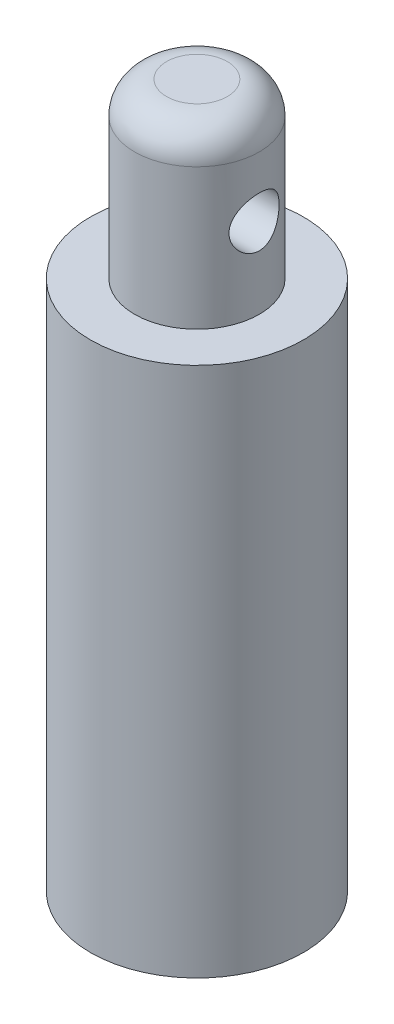
ISO-10303-21;
HEADER;
FILE_DESCRIPTION(('STEP AP214'),'2;1');
FILE_NAME('part.step','',(''),(''),'','','');
FILE_SCHEMA(('AUTOMOTIVE_DESIGN { 1 0 10303 214 1 1 1 1 }'));
ENDSEC;
DATA;
#1=APPLICATION_CONTEXT('core data for automotive mechanical design processes');
#2=APPLICATION_PROTOCOL_DEFINITION('international standard','automotive_design',2000,#1);
#3=PRODUCT_CONTEXT('',#1,'mechanical');
#4=PRODUCT('Part','Part','',(#3));
#5=PRODUCT_RELATED_PRODUCT_CATEGORY('part','',(#4));
#6=PRODUCT_DEFINITION_FORMATION('','',#4);
#7=PRODUCT_DEFINITION_CONTEXT('part definition',#1,'design');
#8=PRODUCT_DEFINITION('design','',#6,#7);
#9=PRODUCT_DEFINITION_SHAPE('','',#8);
#10=(LENGTH_UNIT() NAMED_UNIT(*) SI_UNIT(.MILLI.,.METRE.));
#11=(NAMED_UNIT(*) PLANE_ANGLE_UNIT() SI_UNIT($,.RADIAN.));
#12=(NAMED_UNIT(*) SI_UNIT($,.STERADIAN.) SOLID_ANGLE_UNIT());
#13=UNCERTAINTY_MEASURE_WITH_UNIT(LENGTH_MEASURE(1.E-05),#10,'distance_accuracy_value','');
#14=(GEOMETRIC_REPRESENTATION_CONTEXT(3) GLOBAL_UNCERTAINTY_ASSIGNED_CONTEXT((#13)) GLOBAL_UNIT_ASSIGNED_CONTEXT((#10,
#11,#12)) REPRESENTATION_CONTEXT('',''));
#15=CARTESIAN_POINT('',(0.,0.,0.));
#16=DIRECTION('',(0.,0.,1.));
#17=DIRECTION('',(1.,0.,0.));
#18=AXIS2_PLACEMENT_3D('',#15,#16,#17);
#19=CARTESIAN_POINT('',(0.,24.9,0.));
#20=DIRECTION('',(0.,-1.,0.));
#21=DIRECTION('',(0.,0.,-1.));
#22=AXIS2_PLACEMENT_3D('',#19,#20,#21);
#23=CYLINDRICAL_SURFACE('',#22,5.);
#24=CARTESIAN_POINT('',(0.,24.9,0.));
#25=DIRECTION('',(0.,1.,0.));
#26=DIRECTION('',(0.,0.,1.));
#27=AXIS2_PLACEMENT_3D('',#24,#25,#26);
#28=CIRCLE('',#27,5.);
#29=CARTESIAN_POINT('',(0.,24.9,5.));
#30=VERTEX_POINT('',#29);
#31=EDGE_CURVE('E123',#30,#30,#28,.T.);
#32=ORIENTED_EDGE('',*,*,#31,.F.);
#33=EDGE_LOOP('',(#32));
#34=FACE_BOUND('',#33,.T.);
#35=CARTESIAN_POINT('',(0.,0.,0.));
#36=DIRECTION('',(0.,1.,0.));
#37=DIRECTION('',(0.,0.,1.));
#38=AXIS2_PLACEMENT_3D('',#35,#36,#37);
#39=CIRCLE('',#38,5.);
#40=CARTESIAN_POINT('',(0.,0.,5.));
#41=VERTEX_POINT('',#40);
#42=EDGE_CURVE('E127',#41,#41,#39,.T.);
#43=ORIENTED_EDGE('',*,*,#42,.T.);
#44=EDGE_LOOP('',(#43));
#45=FACE_BOUND('',#44,.T.);
#46=ADVANCED_FACE('F39',(#34,#45),#23,.T.);
#47=CARTESIAN_POINT('',(0.,24.9,0.));
#48=DIRECTION('',(0.,1.,0.));
#49=DIRECTION('',(0.,0.,1.));
#50=AXIS2_PLACEMENT_3D('',#47,#48,#49);
#51=PLANE('',#50);
#52=CARTESIAN_POINT('',(0.,24.9,0.));
#53=DIRECTION('',(0.,1.,0.));
#54=DIRECTION('',(0.,0.,1.));
#55=AXIS2_PLACEMENT_3D('',#52,#53,#54);
#56=CIRCLE('',#55,2.925);
#57=CARTESIAN_POINT('',(0.,24.9,2.925));
#58=VERTEX_POINT('',#57);
#59=EDGE_CURVE('E59',#58,#58,#56,.T.);
#60=ORIENTED_EDGE('',*,*,#59,.F.);
#61=EDGE_LOOP('',(#60));
#62=FACE_BOUND('',#61,.T.);
#63=ORIENTED_EDGE('',*,*,#31,.T.);
#64=EDGE_LOOP('',(#63));
#65=FACE_BOUND('',#64,.T.);
#66=ADVANCED_FACE('F89',(#62,#65),#51,.T.);
#67=CARTESIAN_POINT('',(0.,0.,0.));
#68=DIRECTION('',(0.,1.,0.));
#69=DIRECTION('',(0.,0.,1.));
#70=AXIS2_PLACEMENT_3D('',#67,#68,#69);
#71=PLANE('',#70);
#72=CARTESIAN_POINT('',(0.,0.,0.));
#73=DIRECTION('',(0.,-1.,0.));
#74=DIRECTION('',(0.,0.,-1.));
#75=AXIS2_PLACEMENT_3D('',#72,#73,#74);
#76=CIRCLE('',#75,1.25);
#77=CARTESIAN_POINT('',(0.,0.,-1.25));
#78=VERTEX_POINT('',#77);
#79=EDGE_CURVE('E130',#78,#78,#76,.T.);
#80=ORIENTED_EDGE('',*,*,#79,.F.);
#81=EDGE_LOOP('',(#80));
#82=FACE_BOUND('',#81,.T.);
#83=ORIENTED_EDGE('',*,*,#42,.F.);
#84=EDGE_LOOP('',(#83));
#85=FACE_BOUND('',#84,.T.);
#86=ADVANCED_FACE('F94',(#82,#85),#71,.F.);
#87=CARTESIAN_POINT('',(0.,74.2731493398826,0.));
#88=DIRECTION('',(0.,-1.,0.));
#89=DIRECTION('',(0.,0.,-1.));
#90=AXIS2_PLACEMENT_3D('',#87,#88,#89);
#91=CYLINDRICAL_SURFACE('',#90,2.925);
#92=CARTESIAN_POINT('',(-2.67861904719577,28.66,-1.175));
#93=CARTESIAN_POINT('',(-2.67862465040793,28.7228975320763,-1.17499403671711));
#94=CARTESIAN_POINT('',(-2.68086642394981,28.7859066034297,-1.16991780599071));
#95=CARTESIAN_POINT('',(-2.68955216078559,28.9101198813495,-1.14980290608418));
#96=CARTESIAN_POINT('',(-2.69600789389022,28.9713185293552,-1.13473633147664));
#97=CARTESIAN_POINT('',(-2.71226344115861,29.0898959277224,-1.09530878050239));
#98=CARTESIAN_POINT('',(-2.72205026133472,29.1472885008416,-1.07098387630516));
#99=CARTESIAN_POINT('',(-2.74384657679336,29.2571598552541,-1.01383548302336));
#100=CARTESIAN_POINT('',(-2.75585543651383,29.3096400351743,-0.981014422995563));
#101=CARTESIAN_POINT('',(-2.78151936625246,29.4112619045732,-0.905777580736321));
#102=CARTESIAN_POINT('',(-2.79522770319647,29.4600850380491,-0.862949487507886));
#103=CARTESIAN_POINT('',(-2.82230643444271,29.5500894470323,-0.76978141841912));
#104=CARTESIAN_POINT('',(-2.83567670212224,29.5912678948258,-0.719438675316639));
#105=CARTESIAN_POINT('',(-2.86121244977089,29.6663977357908,-0.610207285217777));
#106=CARTESIAN_POINT('',(-2.87330876041852,29.6999960799436,-0.551058176716488));
#107=CARTESIAN_POINT('',(-2.89428771208504,29.7566295461585,-0.42737472238132));
#108=CARTESIAN_POINT('',(-2.90317168426229,29.779669044753,-0.36284262087633));
#109=CARTESIAN_POINT('',(-2.91634801890909,29.8133928023854,-0.233564121035802));
#110=CARTESIAN_POINT('',(-2.92084322075447,29.8246249276889,-0.168981729422));
#111=CARTESIAN_POINT('',(-2.92546904753595,29.8361798776467,-0.0387028057326151));
#112=CARTESIAN_POINT('',(-2.92560131196844,29.8365068002381,0.0269932985487616));
#113=CARTESIAN_POINT('',(-2.92160938329308,29.8265410739927,0.153672063400207));
#114=CARTESIAN_POINT('',(-2.91772586321393,29.8168488978012,0.214710926976796));
#115=CARTESIAN_POINT('',(-2.90646374869963,29.7881422695966,0.334211075761342));
#116=CARTESIAN_POINT('',(-2.89908489782055,29.7691271335769,0.39267217150068));
#117=CARTESIAN_POINT('',(-2.88141219078973,29.7220814353269,0.506413057481175));
#118=CARTESIAN_POINT('',(-2.87107600956833,29.6939191042034,0.561631496938395));
#119=CARTESIAN_POINT('',(-2.84851295734539,29.6295024563717,0.666701541257781));
#120=CARTESIAN_POINT('',(-2.83628543649293,29.5932453564525,0.716551291452558));
#121=CARTESIAN_POINT('',(-2.81022453971089,29.5108737452722,0.812970020027701));
#122=CARTESIAN_POINT('',(-2.79633844191094,29.4642658285333,0.859103856620626));
#123=CARTESIAN_POINT('',(-2.76914749377162,29.3639230513405,0.943079903064207));
#124=CARTESIAN_POINT('',(-2.75584283818622,29.3101858268837,0.980919351497115));
#125=CARTESIAN_POINT('',(-2.73096077867422,29.1951479083672,1.04823991672386));
#126=CARTESIAN_POINT('',(-2.71944390135763,29.1336744135001,1.0774500001282));
#127=CARTESIAN_POINT('',(-2.70015222645472,29.0060951835747,1.1249300344674));
#128=CARTESIAN_POINT('',(-2.69237497433104,28.9399925196501,1.1432071632754));
#129=CARTESIAN_POINT('',(-2.68204021513644,28.8093742451363,1.16723908723461));
#130=CARTESIAN_POINT('',(-2.67919115868085,28.745010971716,1.17369475812214));
#131=CARTESIAN_POINT('',(-2.67820445740921,28.616071753339,1.17594611051182));
#132=CARTESIAN_POINT('',(-2.68006536453959,28.5514958798413,1.17174506836354));
#133=CARTESIAN_POINT('',(-2.68798949274511,28.4278795563711,1.15344054546176));
#134=CARTESIAN_POINT('',(-2.69380425572666,28.3687346128947,1.13992192589874));
#135=CARTESIAN_POINT('',(-2.70867177381278,28.2535926503545,1.10412636976258));
#136=CARTESIAN_POINT('',(-2.71772525083915,28.1975963363551,1.08184748038172));
#137=CARTESIAN_POINT('',(-2.73850126869327,28.0877960846156,1.0281509085328));
#138=CARTESIAN_POINT('',(-2.75031753609689,28.0341744579104,0.996397830559636));
#139=CARTESIAN_POINT('',(-2.77514580134145,27.9327752483841,0.924996169935102));
#140=CARTESIAN_POINT('',(-2.78815828804321,27.885000073602,0.885344351499035));
#141=CARTESIAN_POINT('',(-2.81508517776081,27.7929439917436,0.795778305748643));
#142=CARTESIAN_POINT('',(-2.82899442861146,27.7491898230686,0.745319093910804));
#143=CARTESIAN_POINT('',(-2.8552353446737,27.6706869925639,0.637443316696028));
#144=CARTESIAN_POINT('',(-2.86756694028802,27.6359387279546,0.580026444603744));
#145=CARTESIAN_POINT('',(-2.88930604922726,27.5765540674298,0.459643398365082));
#146=CARTESIAN_POINT('',(-2.89871349714066,27.5519178977121,0.396677100121641));
#147=CARTESIAN_POINT('',(-2.91351523693128,27.513752301274,0.267022496639671));
#148=CARTESIAN_POINT('',(-2.91891173013912,27.5002167817659,0.200336254654581));
#149=CARTESIAN_POINT('',(-2.92484666523152,27.4853640947164,0.0698617602486086));
#150=CARTESIAN_POINT('',(-2.92568107370275,27.4833023896704,0.00617108274440522));
#151=CARTESIAN_POINT('',(-2.92319931345575,27.4894861194136,-0.120618526601681));
#152=CARTESIAN_POINT('',(-2.91988378505373,27.4977299641034,-0.183717548220032));
#153=CARTESIAN_POINT('',(-2.90962356037842,27.5237582994814,-0.30551399357558));
#154=CARTESIAN_POINT('',(-2.90279528578333,27.5412371910367,-0.364287319713892));
#155=CARTESIAN_POINT('',(-2.88624243745662,27.5849173813194,-0.478055983486748));
#156=CARTESIAN_POINT('',(-2.87651729480489,27.6111203935086,-0.53305057639707));
#157=CARTESIAN_POINT('',(-2.85458772958827,27.6728132349043,-0.64038071762942));
#158=CARTESIAN_POINT('',(-2.84229248948714,27.7086633524028,-0.692490213494245));
#159=CARTESIAN_POINT('',(-2.81670219791645,27.7880920478065,-0.79016926568604));
#160=CARTESIAN_POINT('',(-2.80340681060035,27.8316732285125,-0.835736610103111));
#161=CARTESIAN_POINT('',(-2.77628151859379,27.928541700756,-0.921985156913045));
#162=CARTESIAN_POINT('',(-2.7624699922297,27.9822648190951,-0.962184382102135));
#163=CARTESIAN_POINT('',(-2.73676078533534,28.0961478394376,-1.0330501583217));
#164=CARTESIAN_POINT('',(-2.72486414047554,28.1563111955741,-1.0637115590903));
#165=CARTESIAN_POINT('',(-2.70461536209427,28.2809385372011,-1.11418933670113));
#166=CARTESIAN_POINT('',(-2.69623168816025,28.3453579657227,-1.13410270042304));
#167=CARTESIAN_POINT('',(-2.68407500383333,28.4769470105631,-1.1625905367985));
#168=CARTESIAN_POINT('',(-2.68028652581174,28.5441066097278,-1.17120305663536));
#169=CARTESIAN_POINT('',(-2.67876453183883,28.6276043383492,-1.17466665678694));
#170=CARTESIAN_POINT('',(-2.6786176038861,28.6437984688251,-1.17500153605889));
#171=CARTESIAN_POINT('',(-2.67861904719577,28.66,-1.175));
#172=B_SPLINE_CURVE_WITH_KNOTS('',3,(#92,#93,#94,#95,#96,#97,#98,#99,#100,#101,#102,#103,#104,
#105,#106,#107,#108,#109,#110,#111,#112,#113,#114,#115,#116,#117,#118,#119,#120,#121,#122,#123,
#124,#125,#126,#127,#128,#129,#130,#131,#132,#133,#134,#135,#136,#137,#138,#139,#140,#141,#142,
#143,#144,#145,#146,#147,#148,#149,#150,#151,#152,#153,#154,#155,#156,#157,#158,#159,#160,#161,
#162,#163,#164,#165,#166,#167,#168,#169,#170,#171),.UNSPECIFIED.,.T.,.F.,(4,2,2,2,2,2,2,2,2,2,2,
2,2,2,2,2,2,2,2,2,2,2,2,2,2,2,2,2,2,2,2,2,2,2,2,2,2,2,2,4),(0.,0.188648911935231,
0.377826997883142,0.566275433507113,0.75467005098514,0.95292633569961,1.15125580849562,
1.35748226674711,1.56362316878028,1.75970851965831,1.95572018511338,2.14062921423786,
2.32555181179008,2.51326611837173,2.70104506612057,2.90124530744834,3.10151209975544,
3.30752619328783,3.51340488237199,3.70662441885583,3.89978455822395,4.08180858138559,
4.2638732037095,4.45335659082043,4.64291776160213,4.84662357787431,5.05033837740279,
5.25405773358728,5.45766519983305,5.6478914093299,5.83808827141393,6.02235276778294,
6.20665347600897,6.39912678911289,6.59166502521371,6.79621133895306,7.00086791323306,
7.20364547205341,7.40573856156935,7.45433190262624),.UNSPECIFIED.);
#173=CARTESIAN_POINT('',(-2.67861904719577,28.66,-1.175));
#174=VERTEX_POINT('',#173);
#175=EDGE_CURVE('E43',#174,#174,#172,.T.);
#176=ORIENTED_EDGE('',*,*,#175,.T.);
#177=EDGE_LOOP('',(#176));
#178=FACE_BOUND('',#177,.T.);
#179=CARTESIAN_POINT('',(2.67861904719578,28.66,-1.175));
#180=CARTESIAN_POINT('',(2.67862465040794,28.5971024679237,-1.17499403671711));
#181=CARTESIAN_POINT('',(2.68086642394981,28.5340933965703,-1.16991780599071));
#182=CARTESIAN_POINT('',(2.68955216078558,28.4098801186505,-1.14980290608418));
#183=CARTESIAN_POINT('',(2.69600789389022,28.3486814706448,-1.13473633147664));
#184=CARTESIAN_POINT('',(2.71226344115861,28.2301040722776,-1.09530878050239));
#185=CARTESIAN_POINT('',(2.72205026133472,28.1727114991584,-1.07098387630516));
#186=CARTESIAN_POINT('',(2.74384657679336,28.0628401447459,-1.01383548302336));
#187=CARTESIAN_POINT('',(2.75585543651383,28.0103599648257,-0.981014422995564));
#188=CARTESIAN_POINT('',(2.78151936625246,27.9087380954268,-0.905777580736323));
#189=CARTESIAN_POINT('',(2.79522770319647,27.8599149619509,-0.862949487507888));
#190=CARTESIAN_POINT('',(2.82230643444271,27.7699105529677,-0.769781418419123));
#191=CARTESIAN_POINT('',(2.83567670212224,27.7287321051742,-0.719438675316641));
#192=CARTESIAN_POINT('',(2.86121244977089,27.6536022642092,-0.61020728521778));
#193=CARTESIAN_POINT('',(2.87330876041852,27.6200039200564,-0.55105817671649));
#194=CARTESIAN_POINT('',(2.89428771208504,27.5633704538415,-0.427374722381322));
#195=CARTESIAN_POINT('',(2.90317168426229,27.540330955247,-0.362842620876333));
#196=CARTESIAN_POINT('',(2.91634801890909,27.5066071976146,-0.233564121035804));
#197=CARTESIAN_POINT('',(2.92084322075447,27.4953750723111,-0.168981729422003));
#198=CARTESIAN_POINT('',(2.92546904753595,27.4838201223533,-0.0387028057326177));
#199=CARTESIAN_POINT('',(2.92560131196844,27.4834931997619,0.0269932985487587));
#200=CARTESIAN_POINT('',(2.92160938329308,27.4934589260073,0.153672063400203));
#201=CARTESIAN_POINT('',(2.91772586321393,27.5031511021988,0.214710926976791));
#202=CARTESIAN_POINT('',(2.90646374869963,27.5318577304034,0.334211075761338));
#203=CARTESIAN_POINT('',(2.89908489782056,27.5508728664231,0.392672171500677));
#204=CARTESIAN_POINT('',(2.88141219078973,27.5979185646731,0.506413057481174));
#205=CARTESIAN_POINT('',(2.87107600956833,27.6260808957966,0.561631496938394));
#206=CARTESIAN_POINT('',(2.84851295734539,27.6904975436283,0.66670154125778));
#207=CARTESIAN_POINT('',(2.83628543649293,27.7267546435475,0.716551291452556));
#208=CARTESIAN_POINT('',(2.81022453971089,27.8091262547278,0.812970020027699));
#209=CARTESIAN_POINT('',(2.79633844191094,27.8557341714667,0.859103856620625));
#210=CARTESIAN_POINT('',(2.76914749377162,27.9560769486595,0.943079903064207));
#211=CARTESIAN_POINT('',(2.75584283818622,28.0098141731163,0.980919351497115));
#212=CARTESIAN_POINT('',(2.73096077867422,28.1248520916328,1.04823991672386));
#213=CARTESIAN_POINT('',(2.71944390135763,28.1863255864999,1.0774500001282));
#214=CARTESIAN_POINT('',(2.70015222645472,28.3139048164253,1.1249300344674));
#215=CARTESIAN_POINT('',(2.69237497433104,28.3800074803499,1.1432071632754));
#216=CARTESIAN_POINT('',(2.68204021513644,28.5106257548637,1.16723908723461));
#217=CARTESIAN_POINT('',(2.67919115868085,28.574989028284,1.17369475812214));
#218=CARTESIAN_POINT('',(2.67820445740921,28.703928246661,1.17594611051182));
#219=CARTESIAN_POINT('',(2.68006536453959,28.7685041201587,1.17174506836354));
#220=CARTESIAN_POINT('',(2.68798949274511,28.8921204436289,1.15344054546176));
#221=CARTESIAN_POINT('',(2.69380425572666,28.9512653871052,1.13992192589874));
#222=CARTESIAN_POINT('',(2.70867177381277,29.0664073496455,1.10412636976258));
#223=CARTESIAN_POINT('',(2.71772525083915,29.1224036636449,1.08184748038172));
#224=CARTESIAN_POINT('',(2.73850126869327,29.2322039153844,1.02815090853281));
#225=CARTESIAN_POINT('',(2.75031753609689,29.2858255420896,0.99639783055964));
#226=CARTESIAN_POINT('',(2.77514580134145,29.3872247516159,0.924996169935105));
#227=CARTESIAN_POINT('',(2.78815828804321,29.434999926398,0.885344351499037));
#228=CARTESIAN_POINT('',(2.81508517776081,29.5270560082564,0.795778305748643));
#229=CARTESIAN_POINT('',(2.82899442861146,29.5708101769314,0.745319093910805));
#230=CARTESIAN_POINT('',(2.8552353446737,29.6493130074361,0.63744331669603));
#231=CARTESIAN_POINT('',(2.86756694028802,29.6840612720454,0.580026444603745));
#232=CARTESIAN_POINT('',(2.88930604922726,29.7434459325702,0.459643398365083));
#233=CARTESIAN_POINT('',(2.89871349714066,29.7680821022879,0.396677100121642));
#234=CARTESIAN_POINT('',(2.91351523693128,29.806247698726,0.267022496639672));
#235=CARTESIAN_POINT('',(2.91891173013912,29.8197832182341,0.200336254654581));
#236=CARTESIAN_POINT('',(2.92484666523152,29.8346359052836,0.0698617602486091));
#237=CARTESIAN_POINT('',(2.92568107370275,29.8366976103296,0.00617108274440565));
#238=CARTESIAN_POINT('',(2.92319931345575,29.8305138805864,-0.12061852660168));
#239=CARTESIAN_POINT('',(2.91988378505373,29.8222700358966,-0.183717548220031));
#240=CARTESIAN_POINT('',(2.90962356037842,29.7962417005186,-0.305513993575579));
#241=CARTESIAN_POINT('',(2.90279528578333,29.7787628089633,-0.364287319713893));
#242=CARTESIAN_POINT('',(2.88624243745662,29.7350826186806,-0.478055983486748));
#243=CARTESIAN_POINT('',(2.87651729480489,29.7088796064914,-0.533050576397069));
#244=CARTESIAN_POINT('',(2.85458772958827,29.6471867650957,-0.640380717629418));
#245=CARTESIAN_POINT('',(2.84229248948714,29.6113366475972,-0.692490213494244));
#246=CARTESIAN_POINT('',(2.81670219791645,29.5319079521936,-0.790169265686038));
#247=CARTESIAN_POINT('',(2.80340681060036,29.4883267714875,-0.835736610103109));
#248=CARTESIAN_POINT('',(2.77628151859379,29.391458299244,-0.921985156913043));
#249=CARTESIAN_POINT('',(2.7624699922297,29.3377351809049,-0.962184382102134));
#250=CARTESIAN_POINT('',(2.73676078533534,29.2238521605624,-1.0330501583217));
#251=CARTESIAN_POINT('',(2.72486414047554,29.1636888044259,-1.0637115590903));
#252=CARTESIAN_POINT('',(2.70461536209427,29.0390614627989,-1.11418933670113));
#253=CARTESIAN_POINT('',(2.69623168816025,28.9746420342773,-1.13410270042304));
#254=CARTESIAN_POINT('',(2.68407500383333,28.8430529894369,-1.1625905367985));
#255=CARTESIAN_POINT('',(2.68028652581174,28.7758933902722,-1.17120305663536));
#256=CARTESIAN_POINT('',(2.67876453183883,28.6923956616508,-1.17466665678694));
#257=CARTESIAN_POINT('',(2.6786176038861,28.6762015311749,-1.17500153605889));
#258=CARTESIAN_POINT('',(2.67861904719578,28.66,-1.175));
#259=B_SPLINE_CURVE_WITH_KNOTS('',3,(#179,#180,#181,#182,#183,#184,#185,#186,#187,#188,#189,
#190,#191,#192,#193,#194,#195,#196,#197,#198,#199,#200,#201,#202,#203,#204,#205,#206,#207,#208,
#209,#210,#211,#212,#213,#214,#215,#216,#217,#218,#219,#220,#221,#222,#223,#224,#225,#226,#227,
#228,#229,#230,#231,#232,#233,#234,#235,#236,#237,#238,#239,#240,#241,#242,#243,#244,#245,#246,
#247,#248,#249,#250,#251,#252,#253,#254,#255,#256,#257,#258),.UNSPECIFIED.,.T.,.F.,(4,2,2,2,2,2,
2,2,2,2,2,2,2,2,2,2,2,2,2,2,2,2,2,2,2,2,2,2,2,2,2,2,2,2,2,2,2,2,2,4),(0.,0.188648911935231,
0.377826997883141,0.566275433507113,0.754670050985136,0.952926335699609,1.15125580849562,
1.35748226674711,1.56362316878027,1.75970851965831,1.95572018511338,2.14062921423785,
2.32555181179008,2.51326611837173,2.70104506612057,2.90124530744834,3.10151209975544,
3.30752619328783,3.51340488237199,3.70662441885583,3.89978455822395,4.08180858138558,
4.2638732037095,4.45335659082042,4.64291776160213,4.84662357787431,5.05033837740279,
5.25405773358728,5.45766519983305,5.6478914093299,5.83808827141393,6.02235276778294,
6.20665347600897,6.39912678911289,6.59166502521371,6.79621133895306,7.00086791323306,
7.20364547205341,7.40573856156935,7.45433190262623),.UNSPECIFIED.);
#260=CARTESIAN_POINT('',(2.67861904719578,28.66,-1.175));
#261=VERTEX_POINT('',#260);
#262=EDGE_CURVE('E62',#261,#261,#259,.T.);
#263=ORIENTED_EDGE('',*,*,#262,.T.);
#264=EDGE_LOOP('',(#263));
#265=FACE_BOUND('',#264,.T.);
#266=CARTESIAN_POINT('',(0.,31.5,0.));
#267=DIRECTION('',(0.,1.,0.));
#268=DIRECTION('',(0.,0.,1.));
#269=AXIS2_PLACEMENT_3D('',#266,#267,#268);
#270=CIRCLE('',#269,2.925);
#271=CARTESIAN_POINT('',(0.,31.5,2.925));
#272=VERTEX_POINT('',#271);
#273=EDGE_CURVE('E11',#272,#272,#270,.F.);
#274=ORIENTED_EDGE('',*,*,#273,.T.);
#275=EDGE_LOOP('',(#274));
#276=FACE_BOUND('',#275,.T.);
#277=ORIENTED_EDGE('',*,*,#59,.T.);
#278=EDGE_LOOP('',(#277));
#279=FACE_BOUND('',#278,.T.);
#280=ADVANCED_FACE('F69',(#178,#265,#276,#279),#91,.T.);
#281=CARTESIAN_POINT('',(0.,33.,0.));
#282=DIRECTION('',(0.,1.,0.));
#283=DIRECTION('',(0.,0.,1.));
#284=AXIS2_PLACEMENT_3D('',#281,#282,#283);
#285=PLANE('',#284);
#286=CARTESIAN_POINT('',(0.,33.,0.));
#287=DIRECTION('',(0.,1.,0.));
#288=DIRECTION('',(0.,0.,1.));
#289=AXIS2_PLACEMENT_3D('',#286,#287,#288);
#290=CIRCLE('',#289,1.425);
#291=CARTESIAN_POINT('',(0.,33.,1.425));
#292=VERTEX_POINT('',#291);
#293=EDGE_CURVE('E53',#292,#292,#290,.T.);
#294=ORIENTED_EDGE('',*,*,#293,.T.);
#295=EDGE_LOOP('',(#294));
#296=FACE_BOUND('',#295,.T.);
#297=ADVANCED_FACE('F102',(#296),#285,.T.);
#298=CARTESIAN_POINT('',(0.,31.5,0.));
#299=DIRECTION('',(0.,1.,0.));
#300=DIRECTION('',(0.,0.,1.));
#301=AXIS2_PLACEMENT_3D('',#298,#299,#300);
#302=DEGENERATE_TOROIDAL_SURFACE('',#301,1.425,1.5,.T.);
#303=ORIENTED_EDGE('',*,*,#273,.F.);
#304=EDGE_LOOP('',(#303));
#305=FACE_BOUND('',#304,.T.);
#306=ORIENTED_EDGE('',*,*,#293,.F.);
#307=EDGE_LOOP('',(#306));
#308=FACE_BOUND('',#307,.T.);
#309=ADVANCED_FACE('F41',(#305,#308),#302,.T.);
#310=CARTESIAN_POINT('',(-5.,28.66,0.));
#311=DIRECTION('',(1.,0.,0.));
#312=DIRECTION('',(0.,0.,-1.));
#313=AXIS2_PLACEMENT_3D('',#310,#311,#312);
#314=CYLINDRICAL_SURFACE('',#313,1.175);
#315=ORIENTED_EDGE('',*,*,#262,.F.);
#316=EDGE_LOOP('',(#315));
#317=FACE_BOUND('',#316,.T.);
#318=ORIENTED_EDGE('',*,*,#175,.F.);
#319=EDGE_LOOP('',(#318));
#320=FACE_BOUND('',#319,.T.);
#321=ADVANCED_FACE('F72',(#317,#320),#314,.F.);
#322=CARTESIAN_POINT('',(0.,10.,0.));
#323=DIRECTION('',(0.,-1.,0.));
#324=DIRECTION('',(0.,0.,-1.));
#325=AXIS2_PLACEMENT_3D('',#322,#323,#324);
#326=CYLINDRICAL_SURFACE('',#325,1.25);
#327=CARTESIAN_POINT('',(0.,10.,0.));
#328=DIRECTION('',(0.,-1.,0.));
#329=DIRECTION('',(0.,0.,-1.));
#330=AXIS2_PLACEMENT_3D('',#327,#328,#329);
#331=CIRCLE('',#330,1.25);
#332=CARTESIAN_POINT('',(0.,10.,-1.25));
#333=VERTEX_POINT('',#332);
#334=EDGE_CURVE('E68',#333,#333,#331,.T.);
#335=ORIENTED_EDGE('',*,*,#334,.F.);
#336=EDGE_LOOP('',(#335));
#337=FACE_BOUND('',#336,.T.);
#338=ORIENTED_EDGE('',*,*,#79,.T.);
#339=EDGE_LOOP('',(#338));
#340=FACE_BOUND('',#339,.T.);
#341=ADVANCED_FACE('F76',(#337,#340),#326,.F.);
#342=CARTESIAN_POINT('',(0.,10.,0.));
#343=DIRECTION('',(0.,-1.,0.));
#344=DIRECTION('',(0.,0.,-1.));
#345=AXIS2_PLACEMENT_3D('',#342,#343,#344);
#346=PLANE('',#345);
#347=ORIENTED_EDGE('',*,*,#334,.T.);
#348=EDGE_LOOP('',(#347));
#349=FACE_BOUND('',#348,.T.);
#350=ADVANCED_FACE('F81',(#349),#346,.T.);
#351=CLOSED_SHELL('',(#46,#66,#86,#280,#297,#309,#321,#341,#350));
#352=MANIFOLD_SOLID_BREP('B2',#351);
#353=ADVANCED_BREP_SHAPE_REPRESENTATION('',(#18,#352),#14);
#354=SHAPE_DEFINITION_REPRESENTATION(#9,#353);
ENDSEC;
END-ISO-10303-21;
